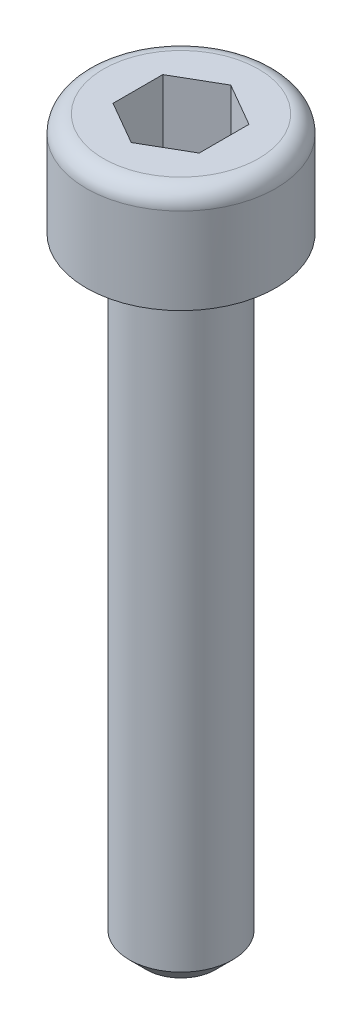
ISO-10303-21;
HEADER;
FILE_DESCRIPTION(('STEP AP214'),'2;1');
FILE_NAME('part.step','',(''),(''),'','','');
FILE_SCHEMA(('AUTOMOTIVE_DESIGN { 1 0 10303 214 1 1 1 1 }'));
ENDSEC;
DATA;
#1=APPLICATION_CONTEXT('core data for automotive mechanical design processes');
#2=APPLICATION_PROTOCOL_DEFINITION('international standard','automotive_design',2000,#1);
#3=PRODUCT_CONTEXT('',#1,'mechanical');
#4=PRODUCT('Part','Part','',(#3));
#5=PRODUCT_RELATED_PRODUCT_CATEGORY('part','',(#4));
#6=PRODUCT_DEFINITION_FORMATION('','',#4);
#7=PRODUCT_DEFINITION_CONTEXT('part definition',#1,'design');
#8=PRODUCT_DEFINITION('design','',#6,#7);
#9=PRODUCT_DEFINITION_SHAPE('','',#8);
#10=(LENGTH_UNIT() NAMED_UNIT(*) SI_UNIT(.MILLI.,.METRE.));
#11=(NAMED_UNIT(*) PLANE_ANGLE_UNIT() SI_UNIT($,.RADIAN.));
#12=(NAMED_UNIT(*) SI_UNIT($,.STERADIAN.) SOLID_ANGLE_UNIT());
#13=UNCERTAINTY_MEASURE_WITH_UNIT(LENGTH_MEASURE(1.E-05),#10,'distance_accuracy_value','');
#14=(GEOMETRIC_REPRESENTATION_CONTEXT(3) GLOBAL_UNCERTAINTY_ASSIGNED_CONTEXT((#13)) GLOBAL_UNIT_ASSIGNED_CONTEXT((#10,
#11,#12)) REPRESENTATION_CONTEXT('',''));
#15=CARTESIAN_POINT('',(0.,0.,0.));
#16=DIRECTION('',(0.,0.,1.));
#17=DIRECTION('',(1.,0.,0.));
#18=AXIS2_PLACEMENT_3D('',#15,#16,#17);
#19=CARTESIAN_POINT('',(0.,0.,0.));
#20=DIRECTION('',(0.,-1.,0.));
#21=DIRECTION('',(0.,0.,-1.));
#22=AXIS2_PLACEMENT_3D('',#19,#20,#21);
#23=PLANE('',#22);
#24=CARTESIAN_POINT('',(0.,0.,0.));
#25=DIRECTION('',(0.,-1.,0.));
#26=DIRECTION('',(0.,0.,-1.));
#27=AXIS2_PLACEMENT_3D('',#24,#25,#26);
#28=CIRCLE('',#27,2.25);
#29=CARTESIAN_POINT('',(0.,0.,-2.25));
#30=VERTEX_POINT('',#29);
#31=EDGE_CURVE('E43',#30,#30,#28,.F.);
#32=ORIENTED_EDGE('',*,*,#31,.T.);
#33=EDGE_LOOP('',(#32));
#34=FACE_BOUND('',#33,.T.);
#35=DIRECTION('',(-0.866025403784439,0.,-0.5));
#36=VECTOR('',#35,1.);
#37=CARTESIAN_POINT('',(1.25,0.,-0.721687836487032));
#38=LINE('',#37,#36);
#39=CARTESIAN_POINT('',(1.25,0.,-0.721687836487032));
#40=VERTEX_POINT('',#39);
#41=CARTESIAN_POINT('',(0.,0.,-1.44337567297406));
#42=VERTEX_POINT('',#41);
#43=EDGE_CURVE('E124',#40,#42,#38,.T.);
#44=ORIENTED_EDGE('',*,*,#43,.F.);
#45=DIRECTION('',(0.,0.,-1.));
#46=VECTOR('',#45,1.);
#47=CARTESIAN_POINT('',(1.25,0.,0.721687836487033));
#48=LINE('',#47,#46);
#49=CARTESIAN_POINT('',(1.25,0.,0.721687836487033));
#50=VERTEX_POINT('',#49);
#51=EDGE_CURVE('E50',#50,#40,#48,.T.);
#52=ORIENTED_EDGE('',*,*,#51,.F.);
#53=DIRECTION('',(0.866025403784439,0.,-0.5));
#54=VECTOR('',#53,1.);
#55=CARTESIAN_POINT('',(0.,0.,1.44337567297406));
#56=LINE('',#55,#54);
#57=CARTESIAN_POINT('',(0.,0.,1.44337567297406));
#58=VERTEX_POINT('',#57);
#59=EDGE_CURVE('E133',#58,#50,#56,.T.);
#60=ORIENTED_EDGE('',*,*,#59,.F.);
#61=DIRECTION('',(0.866025403784439,0.,0.5));
#62=VECTOR('',#61,1.);
#63=CARTESIAN_POINT('',(-1.25,0.,0.721687836487031));
#64=LINE('',#63,#62);
#65=CARTESIAN_POINT('',(-1.25,0.,0.721687836487031));
#66=VERTEX_POINT('',#65);
#67=EDGE_CURVE('E131',#66,#58,#64,.T.);
#68=ORIENTED_EDGE('',*,*,#67,.F.);
#69=DIRECTION('',(0.,0.,1.));
#70=VECTOR('',#69,1.);
#71=CARTESIAN_POINT('',(-1.25,0.,-0.721687836487033));
#72=LINE('',#71,#70);
#73=CARTESIAN_POINT('',(-1.25,0.,-0.721687836487033));
#74=VERTEX_POINT('',#73);
#75=EDGE_CURVE('E98',#74,#66,#72,.T.);
#76=ORIENTED_EDGE('',*,*,#75,.F.);
#77=DIRECTION('',(-0.866025403784439,0.,0.5));
#78=VECTOR('',#77,1.);
#79=CARTESIAN_POINT('',(0.,0.,-1.44337567297406));
#80=LINE('',#79,#78);
#81=EDGE_CURVE('E127',#42,#74,#80,.T.);
#82=ORIENTED_EDGE('',*,*,#81,.F.);
#83=EDGE_LOOP('',(#44,#52,#60,#68,#76,#82));
#84=FACE_BOUND('',#83,.T.);
#85=ADVANCED_FACE('F35',(#34,#84),#23,.F.);
#86=CARTESIAN_POINT('',(0.,0.,0.));
#87=DIRECTION('',(0.,1.,0.));
#88=DIRECTION('',(0.,0.,1.));
#89=AXIS2_PLACEMENT_3D('',#86,#87,#88);
#90=CYLINDRICAL_SURFACE('',#89,2.75);
#91=CARTESIAN_POINT('',(0.,-0.5,0.));
#92=DIRECTION('',(0.,-1.,0.));
#93=DIRECTION('',(0.,0.,-1.));
#94=AXIS2_PLACEMENT_3D('',#91,#92,#93);
#95=CIRCLE('',#94,2.75);
#96=CARTESIAN_POINT('',(0.,-0.5,-2.75));
#97=VERTEX_POINT('',#96);
#98=EDGE_CURVE('E11',#97,#97,#95,.T.);
#99=ORIENTED_EDGE('',*,*,#98,.T.);
#100=EDGE_LOOP('',(#99));
#101=FACE_BOUND('',#100,.T.);
#102=CARTESIAN_POINT('',(0.,-3.,0.));
#103=DIRECTION('',(0.,1.,0.));
#104=DIRECTION('',(0.,0.,1.));
#105=AXIS2_PLACEMENT_3D('',#102,#103,#104);
#106=CIRCLE('',#105,2.75);
#107=CARTESIAN_POINT('',(0.,-3.,2.75));
#108=VERTEX_POINT('',#107);
#109=EDGE_CURVE('E145',#108,#108,#106,.T.);
#110=ORIENTED_EDGE('',*,*,#109,.T.);
#111=EDGE_LOOP('',(#110));
#112=FACE_BOUND('',#111,.T.);
#113=ADVANCED_FACE('F167',(#101,#112),#90,.T.);
#114=CARTESIAN_POINT('',(2.75,-3.,0.));
#115=DIRECTION('',(0.,1.,0.));
#116=DIRECTION('',(0.,0.,1.));
#117=AXIS2_PLACEMENT_3D('',#114,#115,#116);
#118=PLANE('',#117);
#119=ORIENTED_EDGE('',*,*,#109,.F.);
#120=EDGE_LOOP('',(#119));
#121=FACE_BOUND('',#120,.T.);
#122=CARTESIAN_POINT('',(0.,-3.,0.));
#123=DIRECTION('',(0.,1.,0.));
#124=DIRECTION('',(0.,0.,1.));
#125=AXIS2_PLACEMENT_3D('',#122,#123,#124);
#126=CIRCLE('',#125,1.5);
#127=CARTESIAN_POINT('',(0.,-3.,1.5));
#128=VERTEX_POINT('',#127);
#129=EDGE_CURVE('E137',#128,#128,#126,.T.);
#130=ORIENTED_EDGE('',*,*,#129,.T.);
#131=EDGE_LOOP('',(#130));
#132=FACE_BOUND('',#131,.T.);
#133=ADVANCED_FACE('F172',(#121,#132),#118,.F.);
#134=CARTESIAN_POINT('',(0.,0.,0.));
#135=DIRECTION('',(0.,1.,0.));
#136=DIRECTION('',(0.,0.,1.));
#137=AXIS2_PLACEMENT_3D('',#134,#135,#136);
#138=CYLINDRICAL_SURFACE('',#137,1.5);
#139=CARTESIAN_POINT('',(0.,-20.5,0.));
#140=DIRECTION('',(0.,1.,0.));
#141=DIRECTION('',(0.,0.,1.));
#142=AXIS2_PLACEMENT_3D('',#139,#140,#141);
#143=CIRCLE('',#142,1.5);
#144=CARTESIAN_POINT('',(0.,-20.5,1.5));
#145=VERTEX_POINT('',#144);
#146=EDGE_CURVE('E148',#145,#145,#143,.T.);
#147=ORIENTED_EDGE('',*,*,#146,.T.);
#148=EDGE_LOOP('',(#147));
#149=FACE_BOUND('',#148,.T.);
#150=ORIENTED_EDGE('',*,*,#129,.F.);
#151=EDGE_LOOP('',(#150));
#152=FACE_BOUND('',#151,.T.);
#153=ADVANCED_FACE('F178',(#149,#152),#138,.T.);
#154=CARTESIAN_POINT('',(1.5,-21.,0.));
#155=DIRECTION('',(0.,1.,0.));
#156=DIRECTION('',(0.,0.,1.));
#157=AXIS2_PLACEMENT_3D('',#154,#155,#156);
#158=PLANE('',#157);
#159=CARTESIAN_POINT('',(0.,-21.,0.));
#160=DIRECTION('',(0.,1.,0.));
#161=DIRECTION('',(0.,0.,1.));
#162=AXIS2_PLACEMENT_3D('',#159,#160,#161);
#163=CIRCLE('',#162,0.999999999999997);
#164=CARTESIAN_POINT('',(0.,-21.,0.999999999999997));
#165=VERTEX_POINT('',#164);
#166=EDGE_CURVE('E151',#165,#165,#163,.F.);
#167=ORIENTED_EDGE('',*,*,#166,.T.);
#168=EDGE_LOOP('',(#167));
#169=FACE_BOUND('',#168,.T.);
#170=ADVANCED_FACE('F182',(#169),#158,.F.);
#171=CARTESIAN_POINT('',(1.25,-2.,0.721687836487033));
#172=DIRECTION('',(1.,0.,0.));
#173=DIRECTION('',(0.,0.,-1.));
#174=AXIS2_PLACEMENT_3D('',#171,#172,#173);
#175=PLANE('',#174);
#176=ORIENTED_EDGE('',*,*,#51,.T.);
#177=DIRECTION('',(0.,1.,0.));
#178=VECTOR('',#177,1.);
#179=CARTESIAN_POINT('',(1.25,-2.,-0.721687836487032));
#180=LINE('',#179,#178);
#181=CARTESIAN_POINT('',(1.25,-2.,-0.721687836487032));
#182=VERTEX_POINT('',#181);
#183=EDGE_CURVE('E80',#182,#40,#180,.T.);
#184=ORIENTED_EDGE('',*,*,#183,.F.);
#185=DIRECTION('',(0.,0.,-1.));
#186=VECTOR('',#185,1.);
#187=CARTESIAN_POINT('',(1.25,-2.,0.721687836487033));
#188=LINE('',#187,#186);
#189=CARTESIAN_POINT('',(1.25,-2.,0.721687836487033));
#190=VERTEX_POINT('',#189);
#191=EDGE_CURVE('E135',#190,#182,#188,.T.);
#192=ORIENTED_EDGE('',*,*,#191,.F.);
#193=DIRECTION('',(0.,1.,0.));
#194=VECTOR('',#193,1.);
#195=CARTESIAN_POINT('',(1.25,-2.,0.721687836487033));
#196=LINE('',#195,#194);
#197=EDGE_CURVE('E58',#190,#50,#196,.T.);
#198=ORIENTED_EDGE('',*,*,#197,.T.);
#199=EDGE_LOOP('',(#176,#184,#192,#198));
#200=FACE_BOUND('',#199,.T.);
#201=ADVANCED_FACE('F186',(#200),#175,.F.);
#202=CARTESIAN_POINT('',(0.,-2.,1.44337567297406));
#203=DIRECTION('',(0.5,0.,0.866025403784439));
#204=DIRECTION('',(0.866025403784439,0.,-0.5));
#205=AXIS2_PLACEMENT_3D('',#202,#203,#204);
#206=PLANE('',#205);
#207=ORIENTED_EDGE('',*,*,#59,.T.);
#208=ORIENTED_EDGE('',*,*,#197,.F.);
#209=DIRECTION('',(0.866025403784439,0.,-0.5));
#210=VECTOR('',#209,1.);
#211=CARTESIAN_POINT('',(0.,-2.,1.44337567297406));
#212=LINE('',#211,#210);
#213=CARTESIAN_POINT('',(0.,-2.,1.44337567297406));
#214=VERTEX_POINT('',#213);
#215=EDGE_CURVE('E110',#214,#190,#212,.T.);
#216=ORIENTED_EDGE('',*,*,#215,.F.);
#217=DIRECTION('',(0.,1.,0.));
#218=VECTOR('',#217,1.);
#219=CARTESIAN_POINT('',(0.,-2.,1.44337567297406));
#220=LINE('',#219,#218);
#221=EDGE_CURVE('E102',#214,#58,#220,.T.);
#222=ORIENTED_EDGE('',*,*,#221,.T.);
#223=EDGE_LOOP('',(#207,#208,#216,#222));
#224=FACE_BOUND('',#223,.T.);
#225=ADVANCED_FACE('F190',(#224),#206,.F.);
#226=CARTESIAN_POINT('',(-1.25,-2.,0.721687836487031));
#227=DIRECTION('',(-0.5,0.,0.866025403784439));
#228=DIRECTION('',(0.866025403784439,0.,0.5));
#229=AXIS2_PLACEMENT_3D('',#226,#227,#228);
#230=PLANE('',#229);
#231=ORIENTED_EDGE('',*,*,#67,.T.);
#232=ORIENTED_EDGE('',*,*,#221,.F.);
#233=DIRECTION('',(0.866025403784439,0.,0.5));
#234=VECTOR('',#233,1.);
#235=CARTESIAN_POINT('',(-1.25,-2.,0.721687836487031));
#236=LINE('',#235,#234);
#237=CARTESIAN_POINT('',(-1.25,-2.,0.721687836487031));
#238=VERTEX_POINT('',#237);
#239=EDGE_CURVE('E106',#238,#214,#236,.T.);
#240=ORIENTED_EDGE('',*,*,#239,.F.);
#241=DIRECTION('',(0.,1.,0.));
#242=VECTOR('',#241,1.);
#243=CARTESIAN_POINT('',(-1.25,-2.,0.721687836487031));
#244=LINE('',#243,#242);
#245=EDGE_CURVE('E91',#238,#66,#244,.T.);
#246=ORIENTED_EDGE('',*,*,#245,.T.);
#247=EDGE_LOOP('',(#231,#232,#240,#246));
#248=FACE_BOUND('',#247,.T.);
#249=ADVANCED_FACE('F107',(#248),#230,.F.);
#250=CARTESIAN_POINT('',(-1.25,-2.,-0.721687836487033));
#251=DIRECTION('',(-1.,0.,0.));
#252=DIRECTION('',(0.,0.,1.));
#253=AXIS2_PLACEMENT_3D('',#250,#251,#252);
#254=PLANE('',#253);
#255=ORIENTED_EDGE('',*,*,#75,.T.);
#256=ORIENTED_EDGE('',*,*,#245,.F.);
#257=DIRECTION('',(0.,0.,1.));
#258=VECTOR('',#257,1.);
#259=CARTESIAN_POINT('',(-1.25,-2.,-0.721687836487033));
#260=LINE('',#259,#258);
#261=CARTESIAN_POINT('',(-1.25,-2.,-0.721687836487033));
#262=VERTEX_POINT('',#261);
#263=EDGE_CURVE('E95',#262,#238,#260,.T.);
#264=ORIENTED_EDGE('',*,*,#263,.F.);
#265=DIRECTION('',(0.,1.,0.));
#266=VECTOR('',#265,1.);
#267=CARTESIAN_POINT('',(-1.25,-2.,-0.721687836487033));
#268=LINE('',#267,#266);
#269=EDGE_CURVE('E103',#262,#74,#268,.T.);
#270=ORIENTED_EDGE('',*,*,#269,.T.);
#271=EDGE_LOOP('',(#255,#256,#264,#270));
#272=FACE_BOUND('',#271,.T.);
#273=ADVANCED_FACE('F93',(#272),#254,.F.);
#274=CARTESIAN_POINT('',(0.,-2.,-1.44337567297406));
#275=DIRECTION('',(-0.5,0.,-0.866025403784439));
#276=DIRECTION('',(-0.866025403784439,0.,0.5));
#277=AXIS2_PLACEMENT_3D('',#274,#275,#276);
#278=PLANE('',#277);
#279=ORIENTED_EDGE('',*,*,#81,.T.);
#280=ORIENTED_EDGE('',*,*,#269,.F.);
#281=DIRECTION('',(-0.866025403784439,0.,0.5));
#282=VECTOR('',#281,1.);
#283=CARTESIAN_POINT('',(0.,-2.,-1.44337567297406));
#284=LINE('',#283,#282);
#285=CARTESIAN_POINT('',(0.,-2.,-1.44337567297406));
#286=VERTEX_POINT('',#285);
#287=EDGE_CURVE('E116',#286,#262,#284,.T.);
#288=ORIENTED_EDGE('',*,*,#287,.F.);
#289=DIRECTION('',(0.,1.,0.));
#290=VECTOR('',#289,1.);
#291=CARTESIAN_POINT('',(0.,-2.,-1.44337567297406));
#292=LINE('',#291,#290);
#293=EDGE_CURVE('E140',#286,#42,#292,.T.);
#294=ORIENTED_EDGE('',*,*,#293,.T.);
#295=EDGE_LOOP('',(#279,#280,#288,#294));
#296=FACE_BOUND('',#295,.T.);
#297=ADVANCED_FACE('F194',(#296),#278,.F.);
#298=CARTESIAN_POINT('',(1.25,-2.,-0.721687836487032));
#299=DIRECTION('',(0.5,0.,-0.866025403784439));
#300=DIRECTION('',(-0.866025403784439,0.,-0.5));
#301=AXIS2_PLACEMENT_3D('',#298,#299,#300);
#302=PLANE('',#301);
#303=ORIENTED_EDGE('',*,*,#43,.T.);
#304=ORIENTED_EDGE('',*,*,#293,.F.);
#305=DIRECTION('',(-0.866025403784439,0.,-0.5));
#306=VECTOR('',#305,1.);
#307=CARTESIAN_POINT('',(1.25,-2.,-0.721687836487032));
#308=LINE('',#307,#306);
#309=EDGE_CURVE('E118',#182,#286,#308,.T.);
#310=ORIENTED_EDGE('',*,*,#309,.F.);
#311=ORIENTED_EDGE('',*,*,#183,.T.);
#312=EDGE_LOOP('',(#303,#304,#310,#311));
#313=FACE_BOUND('',#312,.T.);
#314=ADVANCED_FACE('F191',(#313),#302,.F.);
#315=CARTESIAN_POINT('',(1.25,-2.,-0.721687836487032));
#316=DIRECTION('',(0.,1.,0.));
#317=DIRECTION('',(0.,0.,1.));
#318=AXIS2_PLACEMENT_3D('',#315,#316,#317);
#319=PLANE('',#318);
#320=ORIENTED_EDGE('',*,*,#191,.T.);
#321=ORIENTED_EDGE('',*,*,#309,.T.);
#322=ORIENTED_EDGE('',*,*,#287,.T.);
#323=ORIENTED_EDGE('',*,*,#263,.T.);
#324=ORIENTED_EDGE('',*,*,#239,.T.);
#325=ORIENTED_EDGE('',*,*,#215,.T.);
#326=EDGE_LOOP('',(#320,#321,#322,#323,#324,#325));
#327=FACE_BOUND('',#326,.T.);
#328=ADVANCED_FACE('F113',(#327),#319,.T.);
#329=CARTESIAN_POINT('',(0.,-20.5,0.));
#330=DIRECTION('',(0.,1.,0.));
#331=DIRECTION('',(0.,0.,1.));
#332=AXIS2_PLACEMENT_3D('',#329,#330,#331);
#333=CONICAL_SURFACE('',#332,1.5,0.785398163397452);
#334=ORIENTED_EDGE('',*,*,#166,.F.);
#335=EDGE_LOOP('',(#334));
#336=FACE_BOUND('',#335,.T.);
#337=ORIENTED_EDGE('',*,*,#146,.F.);
#338=EDGE_LOOP('',(#337));
#339=FACE_BOUND('',#338,.T.);
#340=ADVANCED_FACE('F159',(#336,#339),#333,.T.);
#341=CARTESIAN_POINT('',(0.,-0.5,0.));
#342=DIRECTION('',(0.,-1.,0.));
#343=DIRECTION('',(0.,0.,-1.));
#344=AXIS2_PLACEMENT_3D('',#341,#342,#343);
#345=TOROIDAL_SURFACE('',#344,2.25,0.5);
#346=ORIENTED_EDGE('',*,*,#98,.F.);
#347=EDGE_LOOP('',(#346));
#348=FACE_BOUND('',#347,.T.);
#349=ORIENTED_EDGE('',*,*,#31,.F.);
#350=EDGE_LOOP('',(#349));
#351=FACE_BOUND('',#350,.T.);
#352=ADVANCED_FACE('F37',(#348,#351),#345,.T.);
#353=CLOSED_SHELL('',(#85,#113,#133,#153,#170,#201,#225,#249,#273,#297,#314,#328,#340,#352));
#354=MANIFOLD_SOLID_BREP('B2',#353);
#355=ADVANCED_BREP_SHAPE_REPRESENTATION('',(#18,#354),#14);
#356=SHAPE_DEFINITION_REPRESENTATION(#9,#355);
ENDSEC;
END-ISO-10303-21;
